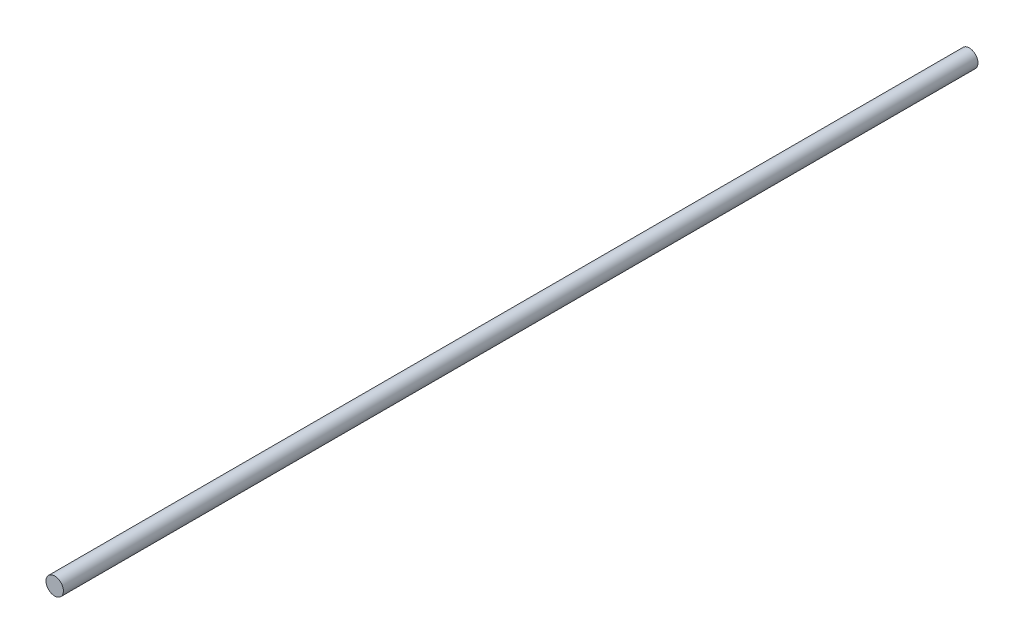
ISO-10303-21;
HEADER;
FILE_DESCRIPTION(('STEP AP214'),'2;1');
FILE_NAME('part.step','',(''),(''),'','','');
FILE_SCHEMA(('AUTOMOTIVE_DESIGN { 1 0 10303 214 1 1 1 1 }'));
ENDSEC;
DATA;
#1=APPLICATION_CONTEXT('core data for automotive mechanical design processes');
#2=APPLICATION_PROTOCOL_DEFINITION('international standard','automotive_design',2000,#1);
#3=PRODUCT_CONTEXT('',#1,'mechanical');
#4=PRODUCT('Part','Part','',(#3));
#5=PRODUCT_RELATED_PRODUCT_CATEGORY('part','',(#4));
#6=PRODUCT_DEFINITION_FORMATION('','',#4);
#7=PRODUCT_DEFINITION_CONTEXT('part definition',#1,'design');
#8=PRODUCT_DEFINITION('design','',#6,#7);
#9=PRODUCT_DEFINITION_SHAPE('','',#8);
#10=(LENGTH_UNIT() NAMED_UNIT(*) SI_UNIT(.MILLI.,.METRE.));
#11=(NAMED_UNIT(*) PLANE_ANGLE_UNIT() SI_UNIT($,.RADIAN.));
#12=(NAMED_UNIT(*) SI_UNIT($,.STERADIAN.) SOLID_ANGLE_UNIT());
#13=UNCERTAINTY_MEASURE_WITH_UNIT(LENGTH_MEASURE(1.E-05),#10,'distance_accuracy_value','');
#14=(GEOMETRIC_REPRESENTATION_CONTEXT(3) GLOBAL_UNCERTAINTY_ASSIGNED_CONTEXT((#13)) GLOBAL_UNIT_ASSIGNED_CONTEXT((#10,
#11,#12)) REPRESENTATION_CONTEXT('',''));
#15=CARTESIAN_POINT('',(0.,0.,0.));
#16=DIRECTION('',(0.,0.,1.));
#17=DIRECTION('',(1.,0.,0.));
#18=AXIS2_PLACEMENT_3D('',#15,#16,#17);
#19=CARTESIAN_POINT('',(0.,0.,2100.));
#20=DIRECTION('',(0.,0.,-1.));
#21=DIRECTION('',(-1.,0.,0.));
#22=AXIS2_PLACEMENT_3D('',#19,#20,#21);
#23=CYLINDRICAL_SURFACE('',#22,20.);
#24=CARTESIAN_POINT('',(0.,0.,2100.));
#25=DIRECTION('',(0.,0.,1.));
#26=DIRECTION('',(1.,0.,0.));
#27=AXIS2_PLACEMENT_3D('',#24,#25,#26);
#28=CIRCLE('',#27,20.);
#29=CARTESIAN_POINT('',(20.,0.,2100.));
#30=VERTEX_POINT('',#29);
#31=EDGE_CURVE('E10',#30,#30,#28,.T.);
#32=ORIENTED_EDGE('',*,*,#31,.F.);
#33=EDGE_LOOP('',(#32));
#34=FACE_BOUND('',#33,.T.);
#35=CARTESIAN_POINT('',(0.,0.,0.));
#36=DIRECTION('',(0.,0.,1.));
#37=DIRECTION('',(1.,0.,0.));
#38=AXIS2_PLACEMENT_3D('',#35,#36,#37);
#39=CIRCLE('',#38,20.);
#40=CARTESIAN_POINT('',(20.,0.,0.));
#41=VERTEX_POINT('',#40);
#42=EDGE_CURVE('E40',#41,#41,#39,.T.);
#43=ORIENTED_EDGE('',*,*,#42,.T.);
#44=EDGE_LOOP('',(#43));
#45=FACE_BOUND('',#44,.T.);
#46=ADVANCED_FACE('F37',(#34,#45),#23,.T.);
#47=CARTESIAN_POINT('',(0.,0.,2100.));
#48=DIRECTION('',(0.,0.,1.));
#49=DIRECTION('',(1.,0.,0.));
#50=AXIS2_PLACEMENT_3D('',#47,#48,#49);
#51=PLANE('',#50);
#52=ORIENTED_EDGE('',*,*,#31,.T.);
#53=EDGE_LOOP('',(#52));
#54=FACE_BOUND('',#53,.T.);
#55=ADVANCED_FACE('F52',(#54),#51,.T.);
#56=CARTESIAN_POINT('',(0.,0.,0.));
#57=DIRECTION('',(0.,0.,1.));
#58=DIRECTION('',(1.,0.,0.));
#59=AXIS2_PLACEMENT_3D('',#56,#57,#58);
#60=PLANE('',#59);
#61=ORIENTED_EDGE('',*,*,#42,.F.);
#62=EDGE_LOOP('',(#61));
#63=FACE_BOUND('',#62,.T.);
#64=ADVANCED_FACE('F50',(#63),#60,.F.);
#65=CLOSED_SHELL('',(#46,#55,#64));
#66=MANIFOLD_SOLID_BREP('B2',#65);
#67=ADVANCED_BREP_SHAPE_REPRESENTATION('',(#18,#66),#14);
#68=SHAPE_DEFINITION_REPRESENTATION(#9,#67);
ENDSEC;
END-ISO-10303-21;
